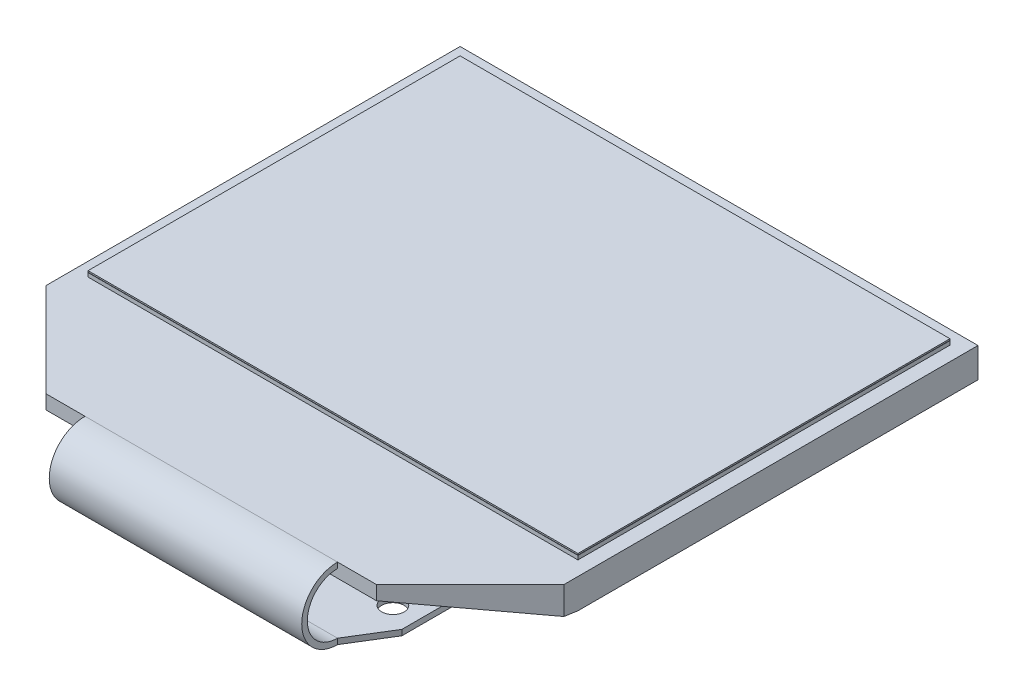
ISO-10303-21;
HEADER;
FILE_DESCRIPTION(('STEP AP214'),'2;1');
FILE_NAME('part.step','',(''),(''),'','','');
FILE_SCHEMA(('AUTOMOTIVE_DESIGN { 1 0 10303 214 1 1 1 1 }'));
ENDSEC;
DATA;
#1=APPLICATION_CONTEXT('core data for automotive mechanical design processes');
#2=APPLICATION_PROTOCOL_DEFINITION('international standard','automotive_design',2000,#1);
#3=PRODUCT_CONTEXT('',#1,'mechanical');
#4=PRODUCT('Part','Part','',(#3));
#5=PRODUCT_RELATED_PRODUCT_CATEGORY('part','',(#4));
#6=PRODUCT_DEFINITION_FORMATION('','',#4);
#7=PRODUCT_DEFINITION_CONTEXT('part definition',#1,'design');
#8=PRODUCT_DEFINITION('design','',#6,#7);
#9=PRODUCT_DEFINITION_SHAPE('','',#8);
#10=(LENGTH_UNIT() NAMED_UNIT(*) SI_UNIT(.MILLI.,.METRE.));
#11=(NAMED_UNIT(*) PLANE_ANGLE_UNIT() SI_UNIT($,.RADIAN.));
#12=(NAMED_UNIT(*) SI_UNIT($,.STERADIAN.) SOLID_ANGLE_UNIT());
#13=UNCERTAINTY_MEASURE_WITH_UNIT(LENGTH_MEASURE(1.E-05),#10,'distance_accuracy_value','');
#14=(GEOMETRIC_REPRESENTATION_CONTEXT(3) GLOBAL_UNCERTAINTY_ASSIGNED_CONTEXT((#13)) GLOBAL_UNIT_ASSIGNED_CONTEXT((#10,
#11,#12)) REPRESENTATION_CONTEXT('',''));
#15=CARTESIAN_POINT('',(0.,0.,0.));
#16=DIRECTION('',(0.,0.,1.));
#17=DIRECTION('',(1.,0.,0.));
#18=AXIS2_PLACEMENT_3D('',#15,#16,#17);
#19=CARTESIAN_POINT('',(8.73,0.71,0.5));
#20=DIRECTION('',(0.,0.,1.));
#21=DIRECTION('',(1.,0.,0.));
#22=AXIS2_PLACEMENT_3D('',#19,#20,#21);
#23=PLANE('',#22);
#24=DIRECTION('',(-1.,0.,0.));
#25=VECTOR('',#24,1.);
#26=CARTESIAN_POINT('',(8.73,0.66,0.5));
#27=LINE('',#26,#25);
#28=CARTESIAN_POINT('',(8.73,0.66,0.5));
#29=VERTEX_POINT('',#28);
#30=CARTESIAN_POINT('',(-8.73,0.66,0.5));
#31=VERTEX_POINT('',#30);
#32=EDGE_CURVE('E104',#29,#31,#27,.T.);
#33=ORIENTED_EDGE('',*,*,#32,.T.);
#34=DIRECTION('',(0.,-1.,0.));
#35=VECTOR('',#34,1.);
#36=CARTESIAN_POINT('',(-8.73,0.71,0.5));
#37=LINE('',#36,#35);
#38=CARTESIAN_POINT('',(-8.73,0.71,0.5));
#39=VERTEX_POINT('',#38);
#40=EDGE_CURVE('E102',#39,#31,#37,.T.);
#41=ORIENTED_EDGE('',*,*,#40,.F.);
#42=DIRECTION('',(-1.,0.,0.));
#43=VECTOR('',#42,1.);
#44=CARTESIAN_POINT('',(8.73,0.71,0.5));
#45=LINE('',#44,#43);
#46=CARTESIAN_POINT('',(8.73,0.71,0.5));
#47=VERTEX_POINT('',#46);
#48=EDGE_CURVE('E88',#47,#39,#45,.T.);
#49=ORIENTED_EDGE('',*,*,#48,.F.);
#50=DIRECTION('',(0.,-1.,0.));
#51=VECTOR('',#50,1.);
#52=CARTESIAN_POINT('',(8.73,0.71,0.5));
#53=LINE('',#52,#51);
#54=EDGE_CURVE('E56',#47,#29,#53,.T.);
#55=ORIENTED_EDGE('',*,*,#54,.T.);
#56=EDGE_LOOP('',(#33,#41,#49,#55));
#57=FACE_BOUND('',#56,.T.);
#58=ADVANCED_FACE('F48',(#57),#23,.F.);
#59=CARTESIAN_POINT('',(0.,0.71,13.76));
#60=DIRECTION('',(0.,0.,-1.));
#61=DIRECTION('',(-1.,0.,0.));
#62=AXIS2_PLACEMENT_3D('',#59,#60,#61);
#63=PLANE('',#62);
#64=DIRECTION('',(1.,0.,0.));
#65=VECTOR('',#64,1.);
#66=CARTESIAN_POINT('',(0.,0.66,13.76));
#67=LINE('',#66,#65);
#68=CARTESIAN_POINT('',(-8.73,0.66,13.76));
#69=VERTEX_POINT('',#68);
#70=CARTESIAN_POINT('',(8.73,0.66,13.76));
#71=VERTEX_POINT('',#70);
#72=EDGE_CURVE('E75',#69,#71,#67,.T.);
#73=ORIENTED_EDGE('',*,*,#72,.T.);
#74=DIRECTION('',(0.,-1.,0.));
#75=VECTOR('',#74,1.);
#76=CARTESIAN_POINT('',(8.73,0.71,13.76));
#77=LINE('',#76,#75);
#78=CARTESIAN_POINT('',(8.73,0.71,13.76));
#79=VERTEX_POINT('',#78);
#80=EDGE_CURVE('E12',#79,#71,#77,.T.);
#81=ORIENTED_EDGE('',*,*,#80,.F.);
#82=DIRECTION('',(1.,0.,0.));
#83=VECTOR('',#82,1.);
#84=CARTESIAN_POINT('',(0.,0.71,13.76));
#85=LINE('',#84,#83);
#86=CARTESIAN_POINT('',(-8.73,0.71,13.76));
#87=VERTEX_POINT('',#86);
#88=EDGE_CURVE('E79',#87,#79,#85,.T.);
#89=ORIENTED_EDGE('',*,*,#88,.F.);
#90=DIRECTION('',(0.,-1.,0.));
#91=VECTOR('',#90,1.);
#92=CARTESIAN_POINT('',(-8.73,0.71,13.76));
#93=LINE('',#92,#91);
#94=EDGE_CURVE('E103',#87,#69,#93,.T.);
#95=ORIENTED_EDGE('',*,*,#94,.T.);
#96=EDGE_LOOP('',(#73,#81,#89,#95));
#97=FACE_BOUND('',#96,.T.);
#98=ADVANCED_FACE('F121',(#97),#63,.F.);
#99=CARTESIAN_POINT('',(8.73,0.71,13.76));
#100=DIRECTION('',(-1.,0.,0.));
#101=DIRECTION('',(0.,0.,1.));
#102=AXIS2_PLACEMENT_3D('',#99,#100,#101);
#103=PLANE('',#102);
#104=DIRECTION('',(0.,0.,-1.));
#105=VECTOR('',#104,1.);
#106=CARTESIAN_POINT('',(8.73,0.66,13.76));
#107=LINE('',#106,#105);
#108=EDGE_CURVE('E96',#71,#29,#107,.T.);
#109=ORIENTED_EDGE('',*,*,#108,.T.);
#110=ORIENTED_EDGE('',*,*,#54,.F.);
#111=DIRECTION('',(0.,0.,-1.));
#112=VECTOR('',#111,1.);
#113=CARTESIAN_POINT('',(8.73,0.71,13.76));
#114=LINE('',#113,#112);
#115=EDGE_CURVE('E64',#79,#47,#114,.T.);
#116=ORIENTED_EDGE('',*,*,#115,.F.);
#117=ORIENTED_EDGE('',*,*,#80,.T.);
#118=EDGE_LOOP('',(#109,#110,#116,#117));
#119=FACE_BOUND('',#118,.T.);
#120=ADVANCED_FACE('F123',(#119),#103,.F.);
#121=CARTESIAN_POINT('',(0.,0.71,0.));
#122=DIRECTION('',(0.,1.,0.));
#123=DIRECTION('',(0.,0.,1.));
#124=AXIS2_PLACEMENT_3D('',#121,#122,#123);
#125=PLANE('',#124);
#126=ORIENTED_EDGE('',*,*,#48,.T.);
#127=DIRECTION('',(0.,0.,-1.));
#128=VECTOR('',#127,1.);
#129=CARTESIAN_POINT('',(-8.73,0.71,13.76));
#130=LINE('',#129,#128);
#131=EDGE_CURVE('E91',#87,#39,#130,.T.);
#132=ORIENTED_EDGE('',*,*,#131,.F.);
#133=ORIENTED_EDGE('',*,*,#88,.T.);
#134=ORIENTED_EDGE('',*,*,#115,.T.);
#135=EDGE_LOOP('',(#126,#132,#133,#134));
#136=FACE_BOUND('',#135,.T.);
#137=ADVANCED_FACE('F90',(#136),#125,.T.);
#138=CARTESIAN_POINT('',(0.,0.66,0.));
#139=DIRECTION('',(0.,1.,0.));
#140=DIRECTION('',(0.,0.,1.));
#141=AXIS2_PLACEMENT_3D('',#138,#139,#140);
#142=PLANE('',#141);
#143=ORIENTED_EDGE('',*,*,#32,.F.);
#144=ORIENTED_EDGE('',*,*,#108,.F.);
#145=ORIENTED_EDGE('',*,*,#72,.F.);
#146=DIRECTION('',(0.,0.,-1.));
#147=VECTOR('',#146,1.);
#148=CARTESIAN_POINT('',(-8.73,0.66,13.76));
#149=LINE('',#148,#147);
#150=EDGE_CURVE('E105',#69,#31,#149,.T.);
#151=ORIENTED_EDGE('',*,*,#150,.T.);
#152=EDGE_LOOP('',(#143,#144,#145,#151));
#153=FACE_BOUND('',#152,.T.);
#154=ADVANCED_FACE('F120',(#153),#142,.F.);
#155=CARTESIAN_POINT('',(-8.73,0.71,13.76));
#156=DIRECTION('',(1.,0.,0.));
#157=DIRECTION('',(0.,0.,1.));
#158=AXIS2_PLACEMENT_3D('',#155,#156,#157);
#159=PLANE('',#158);
#160=ORIENTED_EDGE('',*,*,#150,.F.);
#161=ORIENTED_EDGE('',*,*,#94,.F.);
#162=ORIENTED_EDGE('',*,*,#131,.T.);
#163=ORIENTED_EDGE('',*,*,#40,.T.);
#164=EDGE_LOOP('',(#160,#161,#162,#163));
#165=FACE_BOUND('',#164,.T.);
#166=ADVANCED_FACE('F101',(#165),#159,.F.);
#167=CLOSED_SHELL('',(#58,#98,#120,#137,#154,#166));
#168=MANIFOLD_SOLID_BREP('B2',#167);
#169=CARTESIAN_POINT('',(0.,0.65,13.76));
#170=DIRECTION('',(0.,0.,-1.));
#171=DIRECTION('',(-1.,0.,0.));
#172=AXIS2_PLACEMENT_3D('',#169,#170,#171);
#173=PLANE('',#172);
#174=DIRECTION('',(1.,0.,0.));
#175=VECTOR('',#174,1.);
#176=CARTESIAN_POINT('',(0.,0.51,13.76));
#177=LINE('',#176,#175);
#178=CARTESIAN_POINT('',(-8.73,0.51,13.76));
#179=VERTEX_POINT('',#178);
#180=CARTESIAN_POINT('',(8.73,0.51,13.76));
#181=VERTEX_POINT('',#180);
#182=EDGE_CURVE('E210',#179,#181,#177,.T.);
#183=ORIENTED_EDGE('',*,*,#182,.T.);
#184=DIRECTION('',(0.,-1.,0.));
#185=VECTOR('',#184,1.);
#186=CARTESIAN_POINT('',(8.73,0.65,13.76));
#187=LINE('',#186,#185);
#188=CARTESIAN_POINT('',(8.73,0.65,13.76));
#189=VERTEX_POINT('',#188);
#190=EDGE_CURVE('E46',#189,#181,#187,.T.);
#191=ORIENTED_EDGE('',*,*,#190,.F.);
#192=DIRECTION('',(1.,0.,0.));
#193=VECTOR('',#192,1.);
#194=CARTESIAN_POINT('',(0.,0.65,13.76));
#195=LINE('',#194,#193);
#196=CARTESIAN_POINT('',(-8.73,0.65,13.76));
#197=VERTEX_POINT('',#196);
#198=EDGE_CURVE('E242',#197,#189,#195,.T.);
#199=ORIENTED_EDGE('',*,*,#198,.F.);
#200=DIRECTION('',(0.,-1.,0.));
#201=VECTOR('',#200,1.);
#202=CARTESIAN_POINT('',(-8.73,0.65,13.76));
#203=LINE('',#202,#201);
#204=EDGE_CURVE('E239',#197,#179,#203,.T.);
#205=ORIENTED_EDGE('',*,*,#204,.T.);
#206=EDGE_LOOP('',(#183,#191,#199,#205));
#207=FACE_BOUND('',#206,.T.);
#208=ADVANCED_FACE('F183',(#207),#173,.F.);
#209=CARTESIAN_POINT('',(8.73,0.65,0.5));
#210=DIRECTION('',(-1.,0.,0.));
#211=DIRECTION('',(0.,0.,1.));
#212=AXIS2_PLACEMENT_3D('',#209,#210,#211);
#213=PLANE('',#212);
#214=DIRECTION('',(0.,0.,-1.));
#215=VECTOR('',#214,1.);
#216=CARTESIAN_POINT('',(8.73,0.51,0.5));
#217=LINE('',#216,#215);
#218=CARTESIAN_POINT('',(8.73,0.51,0.5));
#219=VERTEX_POINT('',#218);
#220=EDGE_CURVE('E231',#181,#219,#217,.T.);
#221=ORIENTED_EDGE('',*,*,#220,.T.);
#222=DIRECTION('',(0.,-1.,0.));
#223=VECTOR('',#222,1.);
#224=CARTESIAN_POINT('',(8.73,0.65,0.5));
#225=LINE('',#224,#223);
#226=CARTESIAN_POINT('',(8.73,0.65,0.5));
#227=VERTEX_POINT('',#226);
#228=EDGE_CURVE('E191',#227,#219,#225,.T.);
#229=ORIENTED_EDGE('',*,*,#228,.F.);
#230=DIRECTION('',(0.,0.,-1.));
#231=VECTOR('',#230,1.);
#232=CARTESIAN_POINT('',(8.73,0.65,0.5));
#233=LINE('',#232,#231);
#234=EDGE_CURVE('E199',#189,#227,#233,.T.);
#235=ORIENTED_EDGE('',*,*,#234,.F.);
#236=ORIENTED_EDGE('',*,*,#190,.T.);
#237=EDGE_LOOP('',(#221,#229,#235,#236));
#238=FACE_BOUND('',#237,.T.);
#239=ADVANCED_FACE('F256',(#238),#213,.F.);
#240=CARTESIAN_POINT('',(0.,0.65,0.5));
#241=DIRECTION('',(0.,0.,1.));
#242=DIRECTION('',(1.,0.,0.));
#243=AXIS2_PLACEMENT_3D('',#240,#241,#242);
#244=PLANE('',#243);
#245=DIRECTION('',(-1.,0.,0.));
#246=VECTOR('',#245,1.);
#247=CARTESIAN_POINT('',(0.,0.51,0.5));
#248=LINE('',#247,#246);
#249=CARTESIAN_POINT('',(-8.73,0.51,0.5));
#250=VERTEX_POINT('',#249);
#251=EDGE_CURVE('E248',#219,#250,#248,.T.);
#252=ORIENTED_EDGE('',*,*,#251,.T.);
#253=DIRECTION('',(0.,-1.,0.));
#254=VECTOR('',#253,1.);
#255=CARTESIAN_POINT('',(-8.73,0.65,0.5));
#256=LINE('',#255,#254);
#257=CARTESIAN_POINT('',(-8.73,0.65,0.5));
#258=VERTEX_POINT('',#257);
#259=EDGE_CURVE('E240',#258,#250,#256,.T.);
#260=ORIENTED_EDGE('',*,*,#259,.F.);
#261=DIRECTION('',(-1.,0.,0.));
#262=VECTOR('',#261,1.);
#263=CARTESIAN_POINT('',(0.,0.65,0.5));
#264=LINE('',#263,#262);
#265=EDGE_CURVE('E215',#227,#258,#264,.T.);
#266=ORIENTED_EDGE('',*,*,#265,.F.);
#267=ORIENTED_EDGE('',*,*,#228,.T.);
#268=EDGE_LOOP('',(#252,#260,#266,#267));
#269=FACE_BOUND('',#268,.T.);
#270=ADVANCED_FACE('F254',(#269),#244,.F.);
#271=CARTESIAN_POINT('',(0.,0.65,0.));
#272=DIRECTION('',(0.,1.,0.));
#273=DIRECTION('',(0.,0.,1.));
#274=AXIS2_PLACEMENT_3D('',#271,#272,#273);
#275=PLANE('',#274);
#276=ORIENTED_EDGE('',*,*,#265,.T.);
#277=DIRECTION('',(0.,0.,-1.));
#278=VECTOR('',#277,1.);
#279=CARTESIAN_POINT('',(-8.73,0.65,0.5));
#280=LINE('',#279,#278);
#281=EDGE_CURVE('E232',#197,#258,#280,.T.);
#282=ORIENTED_EDGE('',*,*,#281,.F.);
#283=ORIENTED_EDGE('',*,*,#198,.T.);
#284=ORIENTED_EDGE('',*,*,#234,.T.);
#285=EDGE_LOOP('',(#276,#282,#283,#284));
#286=FACE_BOUND('',#285,.T.);
#287=ADVANCED_FACE('F262',(#286),#275,.T.);
#288=CARTESIAN_POINT('',(0.,0.51,0.));
#289=DIRECTION('',(0.,1.,0.));
#290=DIRECTION('',(0.,0.,1.));
#291=AXIS2_PLACEMENT_3D('',#288,#289,#290);
#292=PLANE('',#291);
#293=ORIENTED_EDGE('',*,*,#182,.F.);
#294=DIRECTION('',(0.,0.,-1.));
#295=VECTOR('',#294,1.);
#296=CARTESIAN_POINT('',(-8.73,0.51,0.5));
#297=LINE('',#296,#295);
#298=EDGE_CURVE('E230',#179,#250,#297,.T.);
#299=ORIENTED_EDGE('',*,*,#298,.T.);
#300=ORIENTED_EDGE('',*,*,#251,.F.);
#301=ORIENTED_EDGE('',*,*,#220,.F.);
#302=EDGE_LOOP('',(#293,#299,#300,#301));
#303=FACE_BOUND('',#302,.T.);
#304=ADVANCED_FACE('F228',(#303),#292,.F.);
#305=CARTESIAN_POINT('',(-8.73,0.65,0.5));
#306=DIRECTION('',(1.,0.,0.));
#307=DIRECTION('',(0.,0.,1.));
#308=AXIS2_PLACEMENT_3D('',#305,#306,#307);
#309=PLANE('',#308);
#310=ORIENTED_EDGE('',*,*,#298,.F.);
#311=ORIENTED_EDGE('',*,*,#204,.F.);
#312=ORIENTED_EDGE('',*,*,#281,.T.);
#313=ORIENTED_EDGE('',*,*,#259,.T.);
#314=EDGE_LOOP('',(#310,#311,#312,#313));
#315=FACE_BOUND('',#314,.T.);
#316=ADVANCED_FACE('F237',(#315),#309,.F.);
#317=CLOSED_SHELL('',(#208,#239,#270,#287,#304,#316));
#318=MANIFOLD_SOLID_BREP('B6',#317);
#319=CARTESIAN_POINT('',(0.,0.5,18.1));
#320=DIRECTION('',(0.,0.,-1.));
#321=DIRECTION('',(-1.,0.,0.));
#322=AXIS2_PLACEMENT_3D('',#319,#320,#321);
#323=PLANE('',#322);
#324=DIRECTION('',(1.,0.,0.));
#325=VECTOR('',#324,1.);
#326=CARTESIAN_POINT('',(0.,0.5,18.1));
#327=LINE('',#326,#325);
#328=CARTESIAN_POINT('',(4.5,0.5,18.1));
#329=VERTEX_POINT('',#328);
#330=CARTESIAN_POINT('',(5.89,0.5,18.1));
#331=VERTEX_POINT('',#330);
#332=EDGE_CURVE('E607',#329,#331,#327,.T.);
#333=ORIENTED_EDGE('',*,*,#332,.F.);
#334=DIRECTION('',(0.,1.,0.));
#335=VECTOR('',#334,1.);
#336=CARTESIAN_POINT('',(4.5,0.3,18.1));
#337=LINE('',#336,#335);
#338=CARTESIAN_POINT('',(4.5,0.3,18.1));
#339=VERTEX_POINT('',#338);
#340=EDGE_CURVE('E518',#339,#329,#337,.T.);
#341=ORIENTED_EDGE('',*,*,#340,.F.);
#342=DIRECTION('',(-1.,0.,0.));
#343=VECTOR('',#342,1.);
#344=CARTESIAN_POINT('',(4.5,0.3,18.1));
#345=LINE('',#344,#343);
#346=CARTESIAN_POINT('',(-4.5,0.3,18.1));
#347=VERTEX_POINT('',#346);
#348=EDGE_CURVE('E529',#339,#347,#345,.T.);
#349=ORIENTED_EDGE('',*,*,#348,.T.);
#350=DIRECTION('',(0.,1.,0.));
#351=VECTOR('',#350,1.);
#352=CARTESIAN_POINT('',(-4.5,0.3,18.1));
#353=LINE('',#352,#351);
#354=CARTESIAN_POINT('',(-4.5,0.5,18.1));
#355=VERTEX_POINT('',#354);
#356=EDGE_CURVE('E513',#347,#355,#353,.T.);
#357=ORIENTED_EDGE('',*,*,#356,.T.);
#358=CARTESIAN_POINT('',(-5.89,0.5,18.1));
#359=VERTEX_POINT('',#358);
#360=EDGE_CURVE('E603',#359,#355,#327,.T.);
#361=ORIENTED_EDGE('',*,*,#360,.F.);
#362=DIRECTION('',(0.,-1.,0.));
#363=VECTOR('',#362,1.);
#364=CARTESIAN_POINT('',(-5.89,0.5,18.1));
#365=LINE('',#364,#363);
#366=CARTESIAN_POINT('',(-5.89,0.,18.1));
#367=VERTEX_POINT('',#366);
#368=EDGE_CURVE('E569',#359,#367,#365,.T.);
#369=ORIENTED_EDGE('',*,*,#368,.T.);
#370=DIRECTION('',(1.,0.,0.));
#371=VECTOR('',#370,1.);
#372=CARTESIAN_POINT('',(0.,0.,18.1));
#373=LINE('',#372,#371);
#374=CARTESIAN_POINT('',(5.89,0.,18.1));
#375=VERTEX_POINT('',#374);
#376=EDGE_CURVE('E602',#367,#375,#373,.T.);
#377=ORIENTED_EDGE('',*,*,#376,.T.);
#378=DIRECTION('',(0.,-1.,0.));
#379=VECTOR('',#378,1.);
#380=CARTESIAN_POINT('',(5.89,0.5,18.1));
#381=LINE('',#380,#379);
#382=EDGE_CURVE('E322',#331,#375,#381,.T.);
#383=ORIENTED_EDGE('',*,*,#382,.F.);
#384=EDGE_LOOP('',(#333,#341,#349,#357,#361,#369,#377,#383));
#385=FACE_BOUND('',#384,.T.);
#386=ADVANCED_FACE('F315',(#385),#323,.F.);
#387=CARTESIAN_POINT('',(9.23,0.5,14.76));
#388=DIRECTION('',(-0.707106781186543,0.,-0.707106781186552));
#389=DIRECTION('',(-0.707106781186552,0.,0.707106781186543));
#390=AXIS2_PLACEMENT_3D('',#387,#388,#389);
#391=PLANE('',#390);
#392=ORIENTED_EDGE('',*,*,#382,.T.);
#393=DIRECTION('',(0.703376927704101,-0.102575801956847,-0.703376927704093));
#394=VECTOR('',#393,1.);
#395=CARTESIAN_POINT('',(9.46232231931654,-0.520963671566989,14.5276776806835));
#396=LINE('',#395,#394);
#397=CARTESIAN_POINT('',(9.23,-0.487083333333328,14.76));
#398=VERTEX_POINT('',#397);
#399=EDGE_CURVE('E181',#375,#398,#396,.T.);
#400=ORIENTED_EDGE('',*,*,#399,.T.);
#401=DIRECTION('',(0.,-1.,0.));
#402=VECTOR('',#401,1.);
#403=CARTESIAN_POINT('',(9.23,0.5,14.76));
#404=LINE('',#403,#402);
#405=CARTESIAN_POINT('',(9.23,0.5,14.76));
#406=VERTEX_POINT('',#405);
#407=EDGE_CURVE('E616',#406,#398,#404,.T.);
#408=ORIENTED_EDGE('',*,*,#407,.F.);
#409=DIRECTION('',(0.707106781186552,0.,-0.707106781186543));
#410=VECTOR('',#409,1.);
#411=CARTESIAN_POINT('',(9.23,0.5,14.76));
#412=LINE('',#411,#410);
#413=EDGE_CURVE('E606',#331,#406,#412,.T.);
#414=ORIENTED_EDGE('',*,*,#413,.F.);
#415=EDGE_LOOP('',(#392,#400,#408,#414));
#416=FACE_BOUND('',#415,.T.);
#417=ADVANCED_FACE('F621',(#416),#391,.F.);
#418=CARTESIAN_POINT('',(9.23,0.5,0.));
#419=DIRECTION('',(-1.,0.,0.));
#420=DIRECTION('',(0.,0.,1.));
#421=AXIS2_PLACEMENT_3D('',#418,#419,#420);
#422=PLANE('',#421);
#423=ORIENTED_EDGE('',*,*,#407,.T.);
#424=DIRECTION('',(0.,-0.144306893071729,-0.989532981063282));
#425=VECTOR('',#424,1.);
#426=CARTESIAN_POINT('',(9.23,0.,18.1));
#427=LINE('',#426,#425);
#428=CARTESIAN_POINT('',(9.23,-0.56,14.26));
#429=VERTEX_POINT('',#428);
#430=EDGE_CURVE('E572',#398,#429,#427,.T.);
#431=ORIENTED_EDGE('',*,*,#430,.T.);
#432=DIRECTION('',(0.,0.,1.));
#433=VECTOR('',#432,1.);
#434=CARTESIAN_POINT('',(9.23,-0.56,0.));
#435=LINE('',#434,#433);
#436=CARTESIAN_POINT('',(9.23,-0.56,0.));
#437=VERTEX_POINT('',#436);
#438=EDGE_CURVE('E597',#437,#429,#435,.T.);
#439=ORIENTED_EDGE('',*,*,#438,.F.);
#440=DIRECTION('',(0.,-1.,0.));
#441=VECTOR('',#440,1.);
#442=CARTESIAN_POINT('',(9.23,0.5,0.));
#443=LINE('',#442,#441);
#444=CARTESIAN_POINT('',(9.23,0.5,0.));
#445=VERTEX_POINT('',#444);
#446=EDGE_CURVE('E612',#445,#437,#443,.T.);
#447=ORIENTED_EDGE('',*,*,#446,.F.);
#448=DIRECTION('',(0.,0.,-1.));
#449=VECTOR('',#448,1.);
#450=CARTESIAN_POINT('',(9.23,0.5,0.));
#451=LINE('',#450,#449);
#452=EDGE_CURVE('E337',#406,#445,#451,.T.);
#453=ORIENTED_EDGE('',*,*,#452,.F.);
#454=EDGE_LOOP('',(#423,#431,#439,#447,#453));
#455=FACE_BOUND('',#454,.T.);
#456=ADVANCED_FACE('F644',(#455),#422,.F.);
#457=CARTESIAN_POINT('',(0.,0.5,0.));
#458=DIRECTION('',(0.,0.,1.));
#459=DIRECTION('',(1.,0.,0.));
#460=AXIS2_PLACEMENT_3D('',#457,#458,#459);
#461=PLANE('',#460);
#462=ORIENTED_EDGE('',*,*,#446,.T.);
#463=DIRECTION('',(1.,0.,0.));
#464=VECTOR('',#463,1.);
#465=CARTESIAN_POINT('',(0.,-0.56,0.));
#466=LINE('',#465,#464);
#467=CARTESIAN_POINT('',(-9.23,-0.56,0.));
#468=VERTEX_POINT('',#467);
#469=EDGE_CURVE('E593',#468,#437,#466,.T.);
#470=ORIENTED_EDGE('',*,*,#469,.F.);
#471=DIRECTION('',(0.,-1.,0.));
#472=VECTOR('',#471,1.);
#473=CARTESIAN_POINT('',(-9.23,0.5,0.));
#474=LINE('',#473,#472);
#475=CARTESIAN_POINT('',(-9.23,0.5,0.));
#476=VERTEX_POINT('',#475);
#477=EDGE_CURVE('E542',#476,#468,#474,.T.);
#478=ORIENTED_EDGE('',*,*,#477,.F.);
#479=DIRECTION('',(-1.,0.,0.));
#480=VECTOR('',#479,1.);
#481=CARTESIAN_POINT('',(0.,0.5,0.));
#482=LINE('',#481,#480);
#483=EDGE_CURVE('E610',#445,#476,#482,.T.);
#484=ORIENTED_EDGE('',*,*,#483,.F.);
#485=EDGE_LOOP('',(#462,#470,#478,#484));
#486=FACE_BOUND('',#485,.T.);
#487=ADVANCED_FACE('F648',(#486),#461,.F.);
#488=CARTESIAN_POINT('',(0.,0.5,0.));
#489=DIRECTION('',(0.,1.,0.));
#490=DIRECTION('',(0.,0.,1.));
#491=AXIS2_PLACEMENT_3D('',#488,#489,#490);
#492=PLANE('',#491);
#493=DIRECTION('',(0.,0.,-1.));
#494=VECTOR('',#493,1.);
#495=CARTESIAN_POINT('',(-6.71,0.5,2.1));
#496=LINE('',#495,#494);
#497=CARTESIAN_POINT('',(-6.71,0.5,12.16));
#498=VERTEX_POINT('',#497);
#499=CARTESIAN_POINT('',(-6.71,0.5,2.1));
#500=VERTEX_POINT('',#499);
#501=EDGE_CURVE('E560',#498,#500,#496,.T.);
#502=ORIENTED_EDGE('',*,*,#501,.T.);
#503=DIRECTION('',(-1.,0.,0.));
#504=VECTOR('',#503,1.);
#505=CARTESIAN_POINT('',(0.,0.5,2.1));
#506=LINE('',#505,#504);
#507=CARTESIAN_POINT('',(6.71,0.5,2.1));
#508=VERTEX_POINT('',#507);
#509=EDGE_CURVE('E579',#508,#500,#506,.T.);
#510=ORIENTED_EDGE('',*,*,#509,.F.);
#511=DIRECTION('',(0.,0.,-1.));
#512=VECTOR('',#511,1.);
#513=CARTESIAN_POINT('',(6.71,0.5,2.1));
#514=LINE('',#513,#512);
#515=CARTESIAN_POINT('',(6.71,0.5,12.16));
#516=VERTEX_POINT('',#515);
#517=EDGE_CURVE('E587',#516,#508,#514,.T.);
#518=ORIENTED_EDGE('',*,*,#517,.F.);
#519=DIRECTION('',(1.,0.,0.));
#520=VECTOR('',#519,1.);
#521=CARTESIAN_POINT('',(0.,0.5,12.16));
#522=LINE('',#521,#520);
#523=EDGE_CURVE('E574',#498,#516,#522,.T.);
#524=ORIENTED_EDGE('',*,*,#523,.F.);
#525=EDGE_LOOP('',(#502,#510,#518,#524));
#526=FACE_BOUND('',#525,.T.);
#527=ORIENTED_EDGE('',*,*,#483,.T.);
#528=DIRECTION('',(0.,0.,-1.));
#529=VECTOR('',#528,1.);
#530=CARTESIAN_POINT('',(-9.23,0.5,0.));
#531=LINE('',#530,#529);
#532=CARTESIAN_POINT('',(-9.23,0.5,14.76));
#533=VERTEX_POINT('',#532);
#534=EDGE_CURVE('E548',#533,#476,#531,.T.);
#535=ORIENTED_EDGE('',*,*,#534,.F.);
#536=DIRECTION('',(-0.707106781186552,0.,-0.707106781186543));
#537=VECTOR('',#536,1.);
#538=CARTESIAN_POINT('',(-9.23,0.5,14.76));
#539=LINE('',#538,#537);
#540=EDGE_CURVE('E566',#359,#533,#539,.T.);
#541=ORIENTED_EDGE('',*,*,#540,.F.);
#542=ORIENTED_EDGE('',*,*,#360,.T.);
#543=DIRECTION('',(-1.,0.,0.));
#544=VECTOR('',#543,1.);
#545=CARTESIAN_POINT('',(4.5,0.5,18.1));
#546=LINE('',#545,#544);
#547=EDGE_CURVE('E520',#329,#355,#546,.T.);
#548=ORIENTED_EDGE('',*,*,#547,.F.);
#549=ORIENTED_EDGE('',*,*,#332,.T.);
#550=ORIENTED_EDGE('',*,*,#413,.T.);
#551=ORIENTED_EDGE('',*,*,#452,.T.);
#552=EDGE_LOOP('',(#527,#535,#541,#542,#548,#549,#550,#551));
#553=FACE_BOUND('',#552,.T.);
#554=ADVANCED_FACE('F649',(#526,#553),#492,.T.);
#555=CARTESIAN_POINT('',(0.,-0.56,0.));
#556=DIRECTION('',(0.,1.,0.));
#557=DIRECTION('',(0.,0.,1.));
#558=AXIS2_PLACEMENT_3D('',#555,#556,#557);
#559=PLANE('',#558);
#560=DIRECTION('',(-1.,0.,0.));
#561=VECTOR('',#560,1.);
#562=CARTESIAN_POINT('',(0.,-0.56,14.26));
#563=LINE('',#562,#561);
#564=CARTESIAN_POINT('',(-9.23,-0.56,14.26));
#565=VERTEX_POINT('',#564);
#566=EDGE_CURVE('E600',#429,#565,#563,.T.);
#567=ORIENTED_EDGE('',*,*,#566,.T.);
#568=DIRECTION('',(0.,0.,1.));
#569=VECTOR('',#568,1.);
#570=CARTESIAN_POINT('',(-9.23,-0.56,0.));
#571=LINE('',#570,#569);
#572=EDGE_CURVE('E539',#468,#565,#571,.T.);
#573=ORIENTED_EDGE('',*,*,#572,.F.);
#574=ORIENTED_EDGE('',*,*,#469,.T.);
#575=ORIENTED_EDGE('',*,*,#438,.T.);
#576=EDGE_LOOP('',(#567,#573,#574,#575));
#577=FACE_BOUND('',#576,.T.);
#578=ADVANCED_FACE('F642',(#577),#559,.F.);
#579=CARTESIAN_POINT('',(0.,0.48,2.1));
#580=DIRECTION('',(0.,0.,-1.));
#581=DIRECTION('',(-1.,0.,0.));
#582=AXIS2_PLACEMENT_3D('',#579,#580,#581);
#583=PLANE('',#582);
#584=ORIENTED_EDGE('',*,*,#509,.T.);
#585=DIRECTION('',(0.,1.,0.));
#586=VECTOR('',#585,1.);
#587=CARTESIAN_POINT('',(-6.71,0.48,2.1));
#588=LINE('',#587,#586);
#589=CARTESIAN_POINT('',(-6.71,0.48,2.1));
#590=VERTEX_POINT('',#589);
#591=EDGE_CURVE('E563',#590,#500,#588,.T.);
#592=ORIENTED_EDGE('',*,*,#591,.F.);
#593=DIRECTION('',(-1.,0.,0.));
#594=VECTOR('',#593,1.);
#595=CARTESIAN_POINT('',(0.,0.48,2.1));
#596=LINE('',#595,#594);
#597=CARTESIAN_POINT('',(6.71,0.48,2.1));
#598=VERTEX_POINT('',#597);
#599=EDGE_CURVE('E582',#598,#590,#596,.T.);
#600=ORIENTED_EDGE('',*,*,#599,.F.);
#601=DIRECTION('',(0.,1.,0.));
#602=VECTOR('',#601,1.);
#603=CARTESIAN_POINT('',(6.71,0.48,2.1));
#604=LINE('',#603,#602);
#605=EDGE_CURVE('E591',#598,#508,#604,.T.);
#606=ORIENTED_EDGE('',*,*,#605,.T.);
#607=EDGE_LOOP('',(#584,#592,#600,#606));
#608=FACE_BOUND('',#607,.T.);
#609=ADVANCED_FACE('F697',(#608),#583,.F.);
#610=CARTESIAN_POINT('',(6.71,0.48,2.1));
#611=DIRECTION('',(1.,0.,0.));
#612=DIRECTION('',(0.,0.,-1.));
#613=AXIS2_PLACEMENT_3D('',#610,#611,#612);
#614=PLANE('',#613);
#615=ORIENTED_EDGE('',*,*,#517,.T.);
#616=ORIENTED_EDGE('',*,*,#605,.F.);
#617=DIRECTION('',(0.,0.,-1.));
#618=VECTOR('',#617,1.);
#619=CARTESIAN_POINT('',(6.71,0.48,2.1));
#620=LINE('',#619,#618);
#621=CARTESIAN_POINT('',(6.71,0.48,12.16));
#622=VERTEX_POINT('',#621);
#623=EDGE_CURVE('E578',#622,#598,#620,.T.);
#624=ORIENTED_EDGE('',*,*,#623,.F.);
#625=DIRECTION('',(0.,1.,0.));
#626=VECTOR('',#625,1.);
#627=CARTESIAN_POINT('',(6.71,0.48,12.16));
#628=LINE('',#627,#626);
#629=EDGE_CURVE('E584',#622,#516,#628,.T.);
#630=ORIENTED_EDGE('',*,*,#629,.T.);
#631=EDGE_LOOP('',(#615,#616,#624,#630));
#632=FACE_BOUND('',#631,.T.);
#633=ADVANCED_FACE('F702',(#632),#614,.F.);
#634=CARTESIAN_POINT('',(0.,0.48,12.16));
#635=DIRECTION('',(0.,0.,1.));
#636=DIRECTION('',(1.,0.,0.));
#637=AXIS2_PLACEMENT_3D('',#634,#635,#636);
#638=PLANE('',#637);
#639=ORIENTED_EDGE('',*,*,#523,.T.);
#640=ORIENTED_EDGE('',*,*,#629,.F.);
#641=DIRECTION('',(1.,0.,0.));
#642=VECTOR('',#641,1.);
#643=CARTESIAN_POINT('',(0.,0.48,12.16));
#644=LINE('',#643,#642);
#645=CARTESIAN_POINT('',(-6.71,0.48,12.16));
#646=VERTEX_POINT('',#645);
#647=EDGE_CURVE('E575',#646,#622,#644,.T.);
#648=ORIENTED_EDGE('',*,*,#647,.F.);
#649=DIRECTION('',(0.,1.,0.));
#650=VECTOR('',#649,1.);
#651=CARTESIAN_POINT('',(-6.71,0.48,12.16));
#652=LINE('',#651,#650);
#653=EDGE_CURVE('E557',#646,#498,#652,.T.);
#654=ORIENTED_EDGE('',*,*,#653,.T.);
#655=EDGE_LOOP('',(#639,#640,#648,#654));
#656=FACE_BOUND('',#655,.T.);
#657=ADVANCED_FACE('F698',(#656),#638,.F.);
#658=CARTESIAN_POINT('',(0.,0.48,0.));
#659=DIRECTION('',(0.,1.,0.));
#660=DIRECTION('',(0.,0.,1.));
#661=AXIS2_PLACEMENT_3D('',#658,#659,#660);
#662=PLANE('',#661);
#663=ORIENTED_EDGE('',*,*,#599,.T.);
#664=DIRECTION('',(0.,0.,-1.));
#665=VECTOR('',#664,1.);
#666=CARTESIAN_POINT('',(-6.71,0.48,2.1));
#667=LINE('',#666,#665);
#668=EDGE_CURVE('E554',#646,#590,#667,.T.);
#669=ORIENTED_EDGE('',*,*,#668,.F.);
#670=ORIENTED_EDGE('',*,*,#647,.T.);
#671=ORIENTED_EDGE('',*,*,#623,.T.);
#672=EDGE_LOOP('',(#663,#669,#670,#671));
#673=FACE_BOUND('',#672,.T.);
#674=ADVANCED_FACE('F701',(#673),#662,.T.);
#675=CARTESIAN_POINT('',(13.1106185074032,0.,18.1));
#676=DIRECTION('',(0.,-0.989532981063282,0.144306893071729));
#677=DIRECTION('',(0.,-0.144306893071729,-0.989532981063282));
#678=AXIS2_PLACEMENT_3D('',#675,#676,#677);
#679=PLANE('',#678);
#680=ORIENTED_EDGE('',*,*,#399,.F.);
#681=ORIENTED_EDGE('',*,*,#376,.F.);
#682=DIRECTION('',(-0.703376927704101,-0.102575801956847,-0.703376927704093));
#683=VECTOR('',#682,1.);
#684=CARTESIAN_POINT('',(-9.46232231931654,-0.520963671566989,14.5276776806835));
#685=LINE('',#684,#683);
#686=CARTESIAN_POINT('',(-9.23,-0.487083333333328,14.76));
#687=VERTEX_POINT('',#686);
#688=EDGE_CURVE('E551',#367,#687,#685,.T.);
#689=ORIENTED_EDGE('',*,*,#688,.T.);
#690=DIRECTION('',(0.,-0.144306893071729,-0.989532981063282));
#691=VECTOR('',#690,1.);
#692=CARTESIAN_POINT('',(-9.23,0.,18.1));
#693=LINE('',#692,#691);
#694=EDGE_CURVE('E545',#687,#565,#693,.T.);
#695=ORIENTED_EDGE('',*,*,#694,.T.);
#696=ORIENTED_EDGE('',*,*,#566,.F.);
#697=ORIENTED_EDGE('',*,*,#430,.F.);
#698=EDGE_LOOP('',(#680,#681,#689,#695,#696,#697));
#699=FACE_BOUND('',#698,.T.);
#700=ADVANCED_FACE('F631',(#699),#679,.T.);
#701=CARTESIAN_POINT('',(-11.995,0.,11.9950000000001));
#702=DIRECTION('',(-0.707106781186543,0.,0.707106781186552));
#703=DIRECTION('',(-0.707106781186552,0.,-0.707106781186543));
#704=AXIS2_PLACEMENT_3D('',#701,#702,#703);
#705=PLANE('',#704);
#706=ORIENTED_EDGE('',*,*,#368,.F.);
#707=ORIENTED_EDGE('',*,*,#540,.T.);
#708=DIRECTION('',(0.,-1.,0.));
#709=VECTOR('',#708,1.);
#710=CARTESIAN_POINT('',(-9.23,0.5,14.76));
#711=LINE('',#710,#709);
#712=EDGE_CURVE('E536',#533,#687,#711,.T.);
#713=ORIENTED_EDGE('',*,*,#712,.T.);
#714=ORIENTED_EDGE('',*,*,#688,.F.);
#715=EDGE_LOOP('',(#706,#707,#713,#714));
#716=FACE_BOUND('',#715,.T.);
#717=ADVANCED_FACE('F633',(#716),#705,.T.);
#718=CARTESIAN_POINT('',(-6.71,0.48,2.1));
#719=DIRECTION('',(-1.,0.,0.));
#720=DIRECTION('',(0.,0.,-1.));
#721=AXIS2_PLACEMENT_3D('',#718,#719,#720);
#722=PLANE('',#721);
#723=ORIENTED_EDGE('',*,*,#501,.F.);
#724=ORIENTED_EDGE('',*,*,#653,.F.);
#725=ORIENTED_EDGE('',*,*,#668,.T.);
#726=ORIENTED_EDGE('',*,*,#591,.T.);
#727=EDGE_LOOP('',(#723,#724,#725,#726));
#728=FACE_BOUND('',#727,.T.);
#729=ADVANCED_FACE('F717',(#728),#722,.F.);
#730=CARTESIAN_POINT('',(-9.23,0.5,0.));
#731=DIRECTION('',(1.,0.,0.));
#732=DIRECTION('',(0.,0.,1.));
#733=AXIS2_PLACEMENT_3D('',#730,#731,#732);
#734=PLANE('',#733);
#735=ORIENTED_EDGE('',*,*,#712,.F.);
#736=ORIENTED_EDGE('',*,*,#534,.T.);
#737=ORIENTED_EDGE('',*,*,#477,.T.);
#738=ORIENTED_EDGE('',*,*,#572,.T.);
#739=ORIENTED_EDGE('',*,*,#694,.F.);
#740=EDGE_LOOP('',(#735,#736,#737,#738,#739));
#741=FACE_BOUND('',#740,.T.);
#742=ADVANCED_FACE('F637',(#741),#734,.F.);
#743=CARTESIAN_POINT('',(4.5,-0.775,18.1));
#744=DIRECTION('',(-1.,0.,0.));
#745=DIRECTION('',(0.,0.,1.));
#746=AXIS2_PLACEMENT_3D('',#743,#744,#745);
#747=CYLINDRICAL_SURFACE('',#746,1.275);
#748=CARTESIAN_POINT('',(-4.5,-0.775,18.1));
#749=DIRECTION('',(1.,0.,0.));
#750=DIRECTION('',(0.,0.,-1.));
#751=AXIS2_PLACEMENT_3D('',#748,#749,#750);
#752=CIRCLE('',#751,1.275);
#753=CARTESIAN_POINT('',(-4.5,-2.05,18.1));
#754=VERTEX_POINT('',#753);
#755=EDGE_CURVE('E509',#355,#754,#752,.T.);
#756=ORIENTED_EDGE('',*,*,#755,.T.);
#757=DIRECTION('',(-1.,0.,0.));
#758=VECTOR('',#757,1.);
#759=CARTESIAN_POINT('',(4.5,-2.05,18.1));
#760=LINE('',#759,#758);
#761=CARTESIAN_POINT('',(4.5,-2.05,18.1));
#762=VERTEX_POINT('',#761);
#763=EDGE_CURVE('E534',#762,#754,#760,.T.);
#764=ORIENTED_EDGE('',*,*,#763,.F.);
#765=CARTESIAN_POINT('',(4.5,-0.775,18.1));
#766=DIRECTION('',(1.,0.,0.));
#767=DIRECTION('',(0.,0.,-1.));
#768=AXIS2_PLACEMENT_3D('',#765,#766,#767);
#769=CIRCLE('',#768,1.275);
#770=EDGE_CURVE('E329',#329,#762,#769,.T.);
#771=ORIENTED_EDGE('',*,*,#770,.F.);
#772=ORIENTED_EDGE('',*,*,#547,.T.);
#773=EDGE_LOOP('',(#756,#764,#771,#772));
#774=FACE_BOUND('',#773,.T.);
#775=ADVANCED_FACE('F655',(#774),#747,.T.);
#776=CARTESIAN_POINT('',(4.5,-0.775,18.1));
#777=DIRECTION('',(-1.,0.,0.));
#778=DIRECTION('',(0.,0.,1.));
#779=AXIS2_PLACEMENT_3D('',#776,#777,#778);
#780=CYLINDRICAL_SURFACE('',#779,1.075);
#781=CARTESIAN_POINT('',(-4.5,-0.775,18.1));
#782=DIRECTION('',(-1.,0.,0.));
#783=DIRECTION('',(0.,0.,-1.));
#784=AXIS2_PLACEMENT_3D('',#781,#782,#783);
#785=CIRCLE('',#784,1.075);
#786=CARTESIAN_POINT('',(-4.5,-1.85,18.1));
#787=VERTEX_POINT('',#786);
#788=EDGE_CURVE('E524',#787,#347,#785,.T.);
#789=ORIENTED_EDGE('',*,*,#788,.T.);
#790=ORIENTED_EDGE('',*,*,#348,.F.);
#791=CARTESIAN_POINT('',(4.5,-0.775,18.1));
#792=DIRECTION('',(-1.,0.,0.));
#793=DIRECTION('',(0.,0.,-1.));
#794=AXIS2_PLACEMENT_3D('',#791,#792,#793);
#795=CIRCLE('',#794,1.075);
#796=CARTESIAN_POINT('',(4.5,-1.85,18.1));
#797=VERTEX_POINT('',#796);
#798=EDGE_CURVE('E516',#797,#339,#795,.T.);
#799=ORIENTED_EDGE('',*,*,#798,.F.);
#800=DIRECTION('',(-1.,0.,0.));
#801=VECTOR('',#800,1.);
#802=CARTESIAN_POINT('',(4.5,-1.85,18.1));
#803=LINE('',#802,#801);
#804=EDGE_CURVE('E532',#797,#787,#803,.T.);
#805=ORIENTED_EDGE('',*,*,#804,.T.);
#806=EDGE_LOOP('',(#789,#790,#799,#805));
#807=FACE_BOUND('',#806,.T.);
#808=ADVANCED_FACE('F665',(#807),#780,.F.);
#809=CARTESIAN_POINT('',(4.5,-0.775,18.1));
#810=DIRECTION('',(1.,0.,0.));
#811=DIRECTION('',(0.,0.,-1.));
#812=AXIS2_PLACEMENT_3D('',#809,#810,#811);
#813=PLANE('',#812);
#814=ORIENTED_EDGE('',*,*,#770,.T.);
#815=DIRECTION('',(0.,1.,0.));
#816=VECTOR('',#815,1.);
#817=CARTESIAN_POINT('',(4.5,-2.05,18.1));
#818=LINE('',#817,#816);
#819=EDGE_CURVE('E512',#762,#797,#818,.T.);
#820=ORIENTED_EDGE('',*,*,#819,.T.);
#821=ORIENTED_EDGE('',*,*,#798,.T.);
#822=ORIENTED_EDGE('',*,*,#340,.T.);
#823=EDGE_LOOP('',(#814,#820,#821,#822));
#824=FACE_BOUND('',#823,.T.);
#825=ADVANCED_FACE('F662',(#824),#813,.T.);
#826=CARTESIAN_POINT('',(-4.5,-0.775,18.1));
#827=DIRECTION('',(1.,0.,0.));
#828=DIRECTION('',(0.,0.,-1.));
#829=AXIS2_PLACEMENT_3D('',#826,#827,#828);
#830=PLANE('',#829);
#831=ORIENTED_EDGE('',*,*,#755,.F.);
#832=ORIENTED_EDGE('',*,*,#356,.F.);
#833=ORIENTED_EDGE('',*,*,#788,.F.);
#834=DIRECTION('',(0.,1.,0.));
#835=VECTOR('',#834,1.);
#836=CARTESIAN_POINT('',(-4.5,-2.05,18.1));
#837=LINE('',#836,#835);
#838=EDGE_CURVE('E473',#754,#787,#837,.T.);
#839=ORIENTED_EDGE('',*,*,#838,.F.);
#840=EDGE_LOOP('',(#831,#832,#833,#839));
#841=FACE_BOUND('',#840,.T.);
#842=ADVANCED_FACE('F654',(#841),#830,.F.);
#843=CARTESIAN_POINT('',(4.5,-1.85,18.1));
#844=DIRECTION('',(0.851349391989745,0.,0.524599097176779));
#845=DIRECTION('',(0.524599097176779,0.,-0.851349391989745));
#846=AXIS2_PLACEMENT_3D('',#843,#844,#845);
#847=PLANE('',#846);
#848=DIRECTION('',(-0.524599097176779,0.,0.851349391989745));
#849=VECTOR('',#848,1.);
#850=CARTESIAN_POINT('',(4.5,-2.05,18.1));
#851=LINE('',#850,#849);
#852=CARTESIAN_POINT('',(5.375,-2.05,16.68));
#853=VERTEX_POINT('',#852);
#854=EDGE_CURVE('E489',#853,#762,#851,.T.);
#855=ORIENTED_EDGE('',*,*,#854,.F.);
#856=DIRECTION('',(0.,-1.,0.));
#857=VECTOR('',#856,1.);
#858=CARTESIAN_POINT('',(5.375,-1.85,16.68));
#859=LINE('',#858,#857);
#860=CARTESIAN_POINT('',(5.375,-1.85,16.68));
#861=VERTEX_POINT('',#860);
#862=EDGE_CURVE('E507',#861,#853,#859,.T.);
#863=ORIENTED_EDGE('',*,*,#862,.F.);
#864=DIRECTION('',(-0.524599097176779,0.,0.851349391989745));
#865=VECTOR('',#864,1.);
#866=CARTESIAN_POINT('',(4.5,-1.85,18.1));
#867=LINE('',#866,#865);
#868=EDGE_CURVE('E492',#861,#797,#867,.T.);
#869=ORIENTED_EDGE('',*,*,#868,.T.);
#870=ORIENTED_EDGE('',*,*,#819,.F.);
#871=EDGE_LOOP('',(#855,#863,#869,#870));
#872=FACE_BOUND('',#871,.T.);
#873=ADVANCED_FACE('F678',(#872),#847,.T.);
#874=CARTESIAN_POINT('',(5.375,-1.85,16.68));
#875=DIRECTION('',(1.,0.,0.));
#876=DIRECTION('',(0.,0.,-1.));
#877=AXIS2_PLACEMENT_3D('',#874,#875,#876);
#878=PLANE('',#877);
#879=DIRECTION('',(0.,0.,1.));
#880=VECTOR('',#879,1.);
#881=CARTESIAN_POINT('',(5.375,-2.05,16.68));
#882=LINE('',#881,#880);
#883=CARTESIAN_POINT('',(5.375,-2.05,12.));
#884=VERTEX_POINT('',#883);
#885=EDGE_CURVE('E494',#884,#853,#882,.T.);
#886=ORIENTED_EDGE('',*,*,#885,.F.);
#887=DIRECTION('',(0.,-1.,0.));
#888=VECTOR('',#887,1.);
#889=CARTESIAN_POINT('',(5.375,-1.85,12.));
#890=LINE('',#889,#888);
#891=CARTESIAN_POINT('',(5.375,-1.85,12.));
#892=VERTEX_POINT('',#891);
#893=EDGE_CURVE('E499',#892,#884,#890,.T.);
#894=ORIENTED_EDGE('',*,*,#893,.F.);
#895=DIRECTION('',(0.,0.,1.));
#896=VECTOR('',#895,1.);
#897=CARTESIAN_POINT('',(5.375,-1.85,16.68));
#898=LINE('',#897,#896);
#899=EDGE_CURVE('E496',#892,#861,#898,.T.);
#900=ORIENTED_EDGE('',*,*,#899,.T.);
#901=ORIENTED_EDGE('',*,*,#862,.T.);
#902=EDGE_LOOP('',(#886,#894,#900,#901));
#903=FACE_BOUND('',#902,.T.);
#904=ADVANCED_FACE('F667',(#903),#878,.T.);
#905=CARTESIAN_POINT('',(5.375,-1.85,12.));
#906=DIRECTION('',(0.,0.,-1.));
#907=DIRECTION('',(-1.,0.,0.));
#908=AXIS2_PLACEMENT_3D('',#905,#906,#907);
#909=PLANE('',#908);
#910=DIRECTION('',(1.,0.,0.));
#911=VECTOR('',#910,1.);
#912=CARTESIAN_POINT('',(5.375,-2.05,12.));
#913=LINE('',#912,#911);
#914=CARTESIAN_POINT('',(-5.375,-2.05,12.));
#915=VERTEX_POINT('',#914);
#916=EDGE_CURVE('E502',#915,#884,#913,.T.);
#917=ORIENTED_EDGE('',*,*,#916,.F.);
#918=DIRECTION('',(0.,-1.,0.));
#919=VECTOR('',#918,1.);
#920=CARTESIAN_POINT('',(-5.375,-1.85,12.));
#921=LINE('',#920,#919);
#922=CARTESIAN_POINT('',(-5.375,-1.85,12.));
#923=VERTEX_POINT('',#922);
#924=EDGE_CURVE('E469',#923,#915,#921,.T.);
#925=ORIENTED_EDGE('',*,*,#924,.F.);
#926=DIRECTION('',(1.,0.,0.));
#927=VECTOR('',#926,1.);
#928=CARTESIAN_POINT('',(5.375,-1.85,12.));
#929=LINE('',#928,#927);
#930=EDGE_CURVE('E456',#923,#892,#929,.T.);
#931=ORIENTED_EDGE('',*,*,#930,.T.);
#932=ORIENTED_EDGE('',*,*,#893,.T.);
#933=EDGE_LOOP('',(#917,#925,#931,#932));
#934=FACE_BOUND('',#933,.T.);
#935=ADVANCED_FACE('F669',(#934),#909,.T.);
#936=CARTESIAN_POINT('',(0.,-1.85,0.));
#937=DIRECTION('',(0.,1.,0.));
#938=DIRECTION('',(0.,0.,1.));
#939=AXIS2_PLACEMENT_3D('',#936,#937,#938);
#940=PLANE('',#939);
#941=CARTESIAN_POINT('',(-4.475,-1.85,16.1));
#942=DIRECTION('',(0.,-1.,0.));
#943=DIRECTION('',(0.,0.,1.));
#944=AXIS2_PLACEMENT_3D('',#941,#942,#943);
#945=CIRCLE('',#944,0.400000000000001);
#946=CARTESIAN_POINT('',(-4.475,-1.85,16.5));
#947=VERTEX_POINT('',#946);
#948=EDGE_CURVE('E479',#947,#947,#945,.T.);
#949=ORIENTED_EDGE('',*,*,#948,.T.);
#950=EDGE_LOOP('',(#949));
#951=FACE_BOUND('',#950,.T.);
#952=CARTESIAN_POINT('',(4.475,-1.85,16.1));
#953=DIRECTION('',(0.,1.,0.));
#954=DIRECTION('',(0.,0.,1.));
#955=AXIS2_PLACEMENT_3D('',#952,#953,#954);
#956=CIRCLE('',#955,0.400000000000001);
#957=CARTESIAN_POINT('',(4.475,-1.85,16.5));
#958=VERTEX_POINT('',#957);
#959=EDGE_CURVE('E484',#958,#958,#956,.T.);
#960=ORIENTED_EDGE('',*,*,#959,.F.);
#961=EDGE_LOOP('',(#960));
#962=FACE_BOUND('',#961,.T.);
#963=ORIENTED_EDGE('',*,*,#868,.F.);
#964=ORIENTED_EDGE('',*,*,#899,.F.);
#965=ORIENTED_EDGE('',*,*,#930,.F.);
#966=DIRECTION('',(0.,0.,1.));
#967=VECTOR('',#966,1.);
#968=CARTESIAN_POINT('',(-5.375,-1.85,16.68));
#969=LINE('',#968,#967);
#970=CARTESIAN_POINT('',(-5.375,-1.85,16.68));
#971=VERTEX_POINT('',#970);
#972=EDGE_CURVE('E446',#923,#971,#969,.T.);
#973=ORIENTED_EDGE('',*,*,#972,.T.);
#974=DIRECTION('',(0.524599097176779,0.,0.851349391989745));
#975=VECTOR('',#974,1.);
#976=CARTESIAN_POINT('',(-4.5,-1.85,18.1));
#977=LINE('',#976,#975);
#978=EDGE_CURVE('E452',#971,#787,#977,.T.);
#979=ORIENTED_EDGE('',*,*,#978,.T.);
#980=ORIENTED_EDGE('',*,*,#804,.F.);
#981=EDGE_LOOP('',(#963,#964,#965,#973,#979,#980));
#982=FACE_BOUND('',#981,.T.);
#983=ADVANCED_FACE('F449',(#951,#962,#982),#940,.T.);
#984=CARTESIAN_POINT('',(0.,-2.05,0.));
#985=DIRECTION('',(0.,1.,0.));
#986=DIRECTION('',(0.,0.,1.));
#987=AXIS2_PLACEMENT_3D('',#984,#985,#986);
#988=PLANE('',#987);
#989=CARTESIAN_POINT('',(-4.475,-2.05,16.1));
#990=DIRECTION('',(0.,-1.,0.));
#991=DIRECTION('',(0.,0.,1.));
#992=AXIS2_PLACEMENT_3D('',#989,#990,#991);
#993=CIRCLE('',#992,0.400000000000001);
#994=CARTESIAN_POINT('',(-4.475,-2.05,16.5));
#995=VERTEX_POINT('',#994);
#996=EDGE_CURVE('E482',#995,#995,#993,.T.);
#997=ORIENTED_EDGE('',*,*,#996,.F.);
#998=EDGE_LOOP('',(#997));
#999=FACE_BOUND('',#998,.T.);
#1000=CARTESIAN_POINT('',(4.475,-2.05,16.1));
#1001=DIRECTION('',(0.,1.,0.));
#1002=DIRECTION('',(0.,0.,1.));
#1003=AXIS2_PLACEMENT_3D('',#1000,#1001,#1002);
#1004=CIRCLE('',#1003,0.400000000000001);
#1005=CARTESIAN_POINT('',(4.475,-2.05,16.5));
#1006=VERTEX_POINT('',#1005);
#1007=EDGE_CURVE('E486',#1006,#1006,#1004,.T.);
#1008=ORIENTED_EDGE('',*,*,#1007,.T.);
#1009=EDGE_LOOP('',(#1008));
#1010=FACE_BOUND('',#1009,.T.);
#1011=ORIENTED_EDGE('',*,*,#854,.T.);
#1012=ORIENTED_EDGE('',*,*,#763,.T.);
#1013=DIRECTION('',(0.524599097176779,0.,0.851349391989745));
#1014=VECTOR('',#1013,1.);
#1015=CARTESIAN_POINT('',(-4.5,-2.05,18.1));
#1016=LINE('',#1015,#1014);
#1017=CARTESIAN_POINT('',(-5.375,-2.05,16.68));
#1018=VERTEX_POINT('',#1017);
#1019=EDGE_CURVE('E476',#1018,#754,#1016,.T.);
#1020=ORIENTED_EDGE('',*,*,#1019,.F.);
#1021=DIRECTION('',(0.,0.,1.));
#1022=VECTOR('',#1021,1.);
#1023=CARTESIAN_POINT('',(-5.375,-2.05,16.68));
#1024=LINE('',#1023,#1022);
#1025=EDGE_CURVE('E465',#915,#1018,#1024,.T.);
#1026=ORIENTED_EDGE('',*,*,#1025,.F.);
#1027=ORIENTED_EDGE('',*,*,#916,.T.);
#1028=ORIENTED_EDGE('',*,*,#885,.T.);
#1029=EDGE_LOOP('',(#1011,#1012,#1020,#1026,#1027,#1028));
#1030=FACE_BOUND('',#1029,.T.);
#1031=ADVANCED_FACE('F657',(#999,#1010,#1030),#988,.F.);
#1032=CARTESIAN_POINT('',(4.475,-2.05,16.1));
#1033=DIRECTION('',(0.,1.,0.));
#1034=DIRECTION('',(0.,0.,1.));
#1035=AXIS2_PLACEMENT_3D('',#1032,#1033,#1034);
#1036=CYLINDRICAL_SURFACE('',#1035,0.400000000000001);
#1037=ORIENTED_EDGE('',*,*,#1007,.F.);
#1038=EDGE_LOOP('',(#1037));
#1039=FACE_BOUND('',#1038,.T.);
#1040=ORIENTED_EDGE('',*,*,#959,.T.);
#1041=EDGE_LOOP('',(#1040));
#1042=FACE_BOUND('',#1041,.T.);
#1043=ADVANCED_FACE('F746',(#1039,#1042),#1036,.F.);
#1044=CARTESIAN_POINT('',(-4.5,-1.85,18.1));
#1045=DIRECTION('',(0.851349391989745,0.,-0.524599097176779));
#1046=DIRECTION('',(-0.524599097176779,0.,-0.851349391989745));
#1047=AXIS2_PLACEMENT_3D('',#1044,#1045,#1046);
#1048=PLANE('',#1047);
#1049=ORIENTED_EDGE('',*,*,#1019,.T.);
#1050=ORIENTED_EDGE('',*,*,#838,.T.);
#1051=ORIENTED_EDGE('',*,*,#978,.F.);
#1052=DIRECTION('',(0.,-1.,0.));
#1053=VECTOR('',#1052,1.);
#1054=CARTESIAN_POINT('',(-5.375,-1.85,16.68));
#1055=LINE('',#1054,#1053);
#1056=EDGE_CURVE('E460',#971,#1018,#1055,.T.);
#1057=ORIENTED_EDGE('',*,*,#1056,.T.);
#1058=EDGE_LOOP('',(#1049,#1050,#1051,#1057));
#1059=FACE_BOUND('',#1058,.T.);
#1060=ADVANCED_FACE('F471',(#1059),#1048,.F.);
#1061=CARTESIAN_POINT('',(-5.375,-1.85,16.68));
#1062=DIRECTION('',(1.,0.,0.));
#1063=DIRECTION('',(0.,0.,-1.));
#1064=AXIS2_PLACEMENT_3D('',#1061,#1062,#1063);
#1065=PLANE('',#1064);
#1066=ORIENTED_EDGE('',*,*,#1025,.T.);
#1067=ORIENTED_EDGE('',*,*,#1056,.F.);
#1068=ORIENTED_EDGE('',*,*,#972,.F.);
#1069=ORIENTED_EDGE('',*,*,#924,.T.);
#1070=EDGE_LOOP('',(#1066,#1067,#1068,#1069));
#1071=FACE_BOUND('',#1070,.T.);
#1072=ADVANCED_FACE('F463',(#1071),#1065,.F.);
#1073=CARTESIAN_POINT('',(-4.475,-2.05,16.1));
#1074=DIRECTION('',(0.,1.,0.));
#1075=DIRECTION('',(0.,0.,1.));
#1076=AXIS2_PLACEMENT_3D('',#1073,#1074,#1075);
#1077=CYLINDRICAL_SURFACE('',#1076,0.400000000000001);
#1078=ORIENTED_EDGE('',*,*,#996,.T.);
#1079=EDGE_LOOP('',(#1078));
#1080=FACE_BOUND('',#1079,.T.);
#1081=ORIENTED_EDGE('',*,*,#948,.F.);
#1082=EDGE_LOOP('',(#1081));
#1083=FACE_BOUND('',#1082,.T.);
#1084=ADVANCED_FACE('F809',(#1080,#1083),#1077,.F.);
#1085=CLOSED_SHELL('',(#386,#417,#456,#487,#554,#578,#609,#633,#657,#674,#700,#717,#729,#742,
#775,#808,#825,#842,#873,#904,#935,#983,#1031,#1043,#1060,#1072,#1084));
#1086=MANIFOLD_SOLID_BREP('B40',#1085);
#1087=ADVANCED_BREP_SHAPE_REPRESENTATION('',(#18,#168,#318,#1086),#14);
#1088=SHAPE_DEFINITION_REPRESENTATION(#9,#1087);
ENDSEC;
END-ISO-10303-21;
